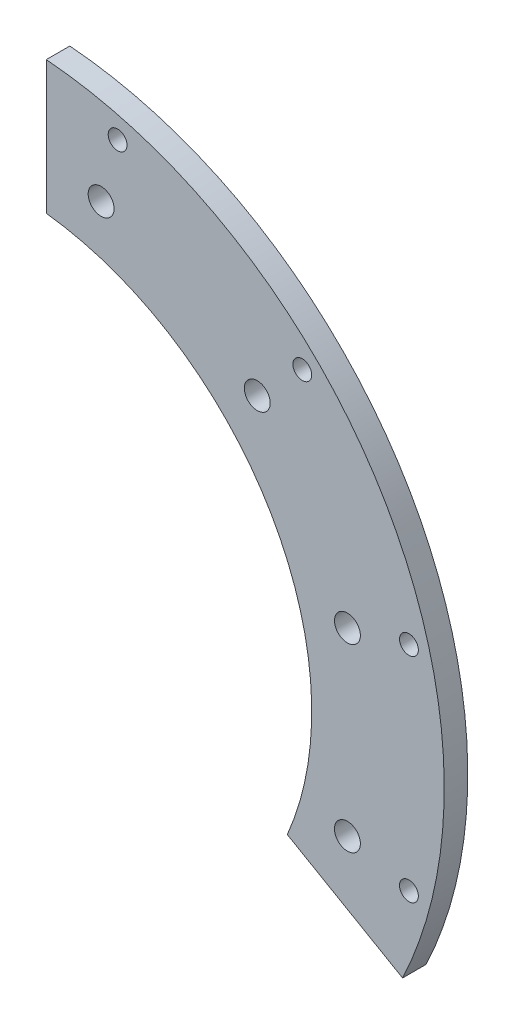
ISO-10303-21;
HEADER;
FILE_DESCRIPTION(('STEP AP214'),'2;1');
FILE_NAME('part.step','',(''),(''),'','','');
FILE_SCHEMA(('AUTOMOTIVE_DESIGN { 1 0 10303 214 1 1 1 1 }'));
ENDSEC;
DATA;
#1=APPLICATION_CONTEXT('core data for automotive mechanical design processes');
#2=APPLICATION_PROTOCOL_DEFINITION('international standard','automotive_design',2000,#1);
#3=PRODUCT_CONTEXT('',#1,'mechanical');
#4=PRODUCT('Part','Part','',(#3));
#5=PRODUCT_RELATED_PRODUCT_CATEGORY('part','',(#4));
#6=PRODUCT_DEFINITION_FORMATION('','',#4);
#7=PRODUCT_DEFINITION_CONTEXT('part definition',#1,'design');
#8=PRODUCT_DEFINITION('design','',#6,#7);
#9=PRODUCT_DEFINITION_SHAPE('','',#8);
#10=(LENGTH_UNIT() NAMED_UNIT(*) SI_UNIT(.MILLI.,.METRE.));
#11=(NAMED_UNIT(*) PLANE_ANGLE_UNIT() SI_UNIT($,.RADIAN.));
#12=(NAMED_UNIT(*) SI_UNIT($,.STERADIAN.) SOLID_ANGLE_UNIT());
#13=UNCERTAINTY_MEASURE_WITH_UNIT(LENGTH_MEASURE(1.E-05),#10,'distance_accuracy_value','');
#14=(GEOMETRIC_REPRESENTATION_CONTEXT(3) GLOBAL_UNCERTAINTY_ASSIGNED_CONTEXT((#13)) GLOBAL_UNIT_ASSIGNED_CONTEXT((#10,
#11,#12)) REPRESENTATION_CONTEXT('',''));
#15=CARTESIAN_POINT('',(0.,0.,0.));
#16=DIRECTION('',(0.,0.,1.));
#17=DIRECTION('',(1.,0.,0.));
#18=AXIS2_PLACEMENT_3D('',#15,#16,#17);
#19=CARTESIAN_POINT('',(0.,0.,4.));
#20=DIRECTION('',(0.,0.,-1.));
#21=DIRECTION('',(-1.,0.,0.));
#22=AXIS2_PLACEMENT_3D('',#19,#20,#21);
#23=CYLINDRICAL_SURFACE('',#22,73.61);
#24=CARTESIAN_POINT('',(0.,0.,0.));
#25=DIRECTION('',(0.,0.,-1.));
#26=DIRECTION('',(-1.,0.,0.));
#27=AXIS2_PLACEMENT_3D('',#24,#25,#26);
#28=CIRCLE('',#27,73.61);
#29=CARTESIAN_POINT('',(5.99999999999999,73.3650604852201,0.));
#30=VERTEX_POINT('',#29);
#31=CARTESIAN_POINT('',(66.5338665235516,-31.490898771331,0.));
#32=VERTEX_POINT('',#31);
#33=EDGE_CURVE('E99',#30,#32,#28,.T.);
#34=ORIENTED_EDGE('',*,*,#33,.F.);
#35=DIRECTION('',(0.,0.,-1.));
#36=VECTOR('',#35,1.);
#37=CARTESIAN_POINT('',(5.99999999999999,73.3650604852201,4.));
#38=LINE('',#37,#36);
#39=CARTESIAN_POINT('',(5.99999999999999,73.3650604852201,4.));
#40=VERTEX_POINT('',#39);
#41=EDGE_CURVE('E11',#40,#30,#38,.T.);
#42=ORIENTED_EDGE('',*,*,#41,.F.);
#43=CARTESIAN_POINT('',(0.,0.,4.));
#44=DIRECTION('',(0.,0.,-1.));
#45=DIRECTION('',(-1.,0.,0.));
#46=AXIS2_PLACEMENT_3D('',#43,#44,#45);
#47=CIRCLE('',#46,73.61);
#48=CARTESIAN_POINT('',(66.5338665235516,-31.490898771331,4.));
#49=VERTEX_POINT('',#48);
#50=EDGE_CURVE('E93',#40,#49,#47,.T.);
#51=ORIENTED_EDGE('',*,*,#50,.T.);
#52=DIRECTION('',(0.,0.,-1.));
#53=VECTOR('',#52,1.);
#54=CARTESIAN_POINT('',(66.5338665235516,-31.490898771331,4.));
#55=LINE('',#54,#53);
#56=EDGE_CURVE('E36',#49,#32,#55,.T.);
#57=ORIENTED_EDGE('',*,*,#56,.T.);
#58=EDGE_LOOP('',(#34,#42,#51,#57));
#59=FACE_BOUND('',#58,.T.);
#60=ADVANCED_FACE('F33',(#59),#23,.T.);
#61=CARTESIAN_POINT('',(5.99999999999999,73.3650604852201,4.));
#62=DIRECTION('',(1.,0.,0.));
#63=DIRECTION('',(0.,1.,0.));
#64=AXIS2_PLACEMENT_3D('',#61,#62,#63);
#65=PLANE('',#64);
#66=DIRECTION('',(0.,-1.,0.));
#67=VECTOR('',#66,1.);
#68=CARTESIAN_POINT('',(5.99999999999999,73.3650604852201,0.));
#69=LINE('',#68,#67);
#70=CARTESIAN_POINT('',(6.,50.7465269747596,0.));
#71=VERTEX_POINT('',#70);
#72=EDGE_CURVE('E66',#30,#71,#69,.T.);
#73=ORIENTED_EDGE('',*,*,#72,.T.);
#74=DIRECTION('',(0.,0.,-1.));
#75=VECTOR('',#74,1.);
#76=CARTESIAN_POINT('',(6.,50.7465269747596,4.));
#77=LINE('',#76,#75);
#78=CARTESIAN_POINT('',(6.,50.7465269747596,4.));
#79=VERTEX_POINT('',#78);
#80=EDGE_CURVE('E42',#79,#71,#77,.T.);
#81=ORIENTED_EDGE('',*,*,#80,.F.);
#82=DIRECTION('',(0.,-1.,0.));
#83=VECTOR('',#82,1.);
#84=CARTESIAN_POINT('',(5.99999999999999,73.3650604852201,4.));
#85=LINE('',#84,#83);
#86=EDGE_CURVE('E83',#40,#79,#85,.T.);
#87=ORIENTED_EDGE('',*,*,#86,.F.);
#88=ORIENTED_EDGE('',*,*,#41,.T.);
#89=EDGE_LOOP('',(#73,#81,#87,#88));
#90=FACE_BOUND('',#89,.T.);
#91=ADVANCED_FACE('F110',(#90),#65,.F.);
#92=CARTESIAN_POINT('',(0.,0.,4.));
#93=DIRECTION('',(0.,0.,-1.));
#94=DIRECTION('',(-1.,0.,0.));
#95=AXIS2_PLACEMENT_3D('',#92,#93,#94);
#96=CYLINDRICAL_SURFACE('',#95,51.1);
#97=CARTESIAN_POINT('',(0.,0.,0.));
#98=DIRECTION('',(0.,0.,-1.));
#99=DIRECTION('',(-1.,0.,0.));
#100=AXIS2_PLACEMENT_3D('',#97,#98,#99);
#101=CIRCLE('',#100,51.1);
#102=CARTESIAN_POINT('',(46.9457992095539,-20.18172283469,0.));
#103=VERTEX_POINT('',#102);
#104=EDGE_CURVE('E90',#71,#103,#101,.T.);
#105=ORIENTED_EDGE('',*,*,#104,.T.);
#106=DIRECTION('',(0.,0.,-1.));
#107=VECTOR('',#106,1.);
#108=CARTESIAN_POINT('',(46.9457992095539,-20.18172283469,4.));
#109=LINE('',#108,#107);
#110=CARTESIAN_POINT('',(46.9457992095539,-20.18172283469,4.));
#111=VERTEX_POINT('',#110);
#112=EDGE_CURVE('E87',#111,#103,#109,.T.);
#113=ORIENTED_EDGE('',*,*,#112,.F.);
#114=CARTESIAN_POINT('',(0.,0.,4.));
#115=DIRECTION('',(0.,0.,-1.));
#116=DIRECTION('',(-1.,0.,0.));
#117=AXIS2_PLACEMENT_3D('',#114,#115,#116);
#118=CIRCLE('',#117,51.1);
#119=EDGE_CURVE('E78',#79,#111,#118,.T.);
#120=ORIENTED_EDGE('',*,*,#119,.F.);
#121=ORIENTED_EDGE('',*,*,#80,.T.);
#122=EDGE_LOOP('',(#105,#113,#120,#121));
#123=FACE_BOUND('',#122,.T.);
#124=ADVANCED_FACE('F88',(#123),#96,.F.);
#125=CARTESIAN_POINT('',(66.5338665235516,-31.490898771331,4.));
#126=DIRECTION('',(-0.499999999999998,-0.86602540378444,0.));
#127=DIRECTION('',(0.86602540378444,-0.499999999999998,0.));
#128=AXIS2_PLACEMENT_3D('',#125,#126,#127);
#129=PLANE('',#128);
#130=DIRECTION('',(-0.86602540378444,0.499999999999998,0.));
#131=VECTOR('',#130,1.);
#132=CARTESIAN_POINT('',(66.5338665235516,-31.490898771331,0.));
#133=LINE('',#132,#131);
#134=EDGE_CURVE('E102',#32,#103,#133,.T.);
#135=ORIENTED_EDGE('',*,*,#134,.F.);
#136=ORIENTED_EDGE('',*,*,#56,.F.);
#137=DIRECTION('',(-0.86602540378444,0.499999999999998,0.));
#138=VECTOR('',#137,1.);
#139=CARTESIAN_POINT('',(66.5338665235516,-31.490898771331,4.));
#140=LINE('',#139,#138);
#141=EDGE_CURVE('E82',#49,#111,#140,.T.);
#142=ORIENTED_EDGE('',*,*,#141,.T.);
#143=ORIENTED_EDGE('',*,*,#112,.T.);
#144=EDGE_LOOP('',(#135,#136,#142,#143));
#145=FACE_BOUND('',#144,.T.);
#146=ADVANCED_FACE('F92',(#145),#129,.T.);
#147=CARTESIAN_POINT('',(0.,0.,4.));
#148=DIRECTION('',(0.,0.,-1.));
#149=DIRECTION('',(-1.,0.,0.));
#150=AXIS2_PLACEMENT_3D('',#147,#148,#149);
#151=PLANE('',#150);
#152=CARTESIAN_POINT('',(41.84657931062,41.8465793106198,4.));
#153=DIRECTION('',(0.,0.,1.));
#154=DIRECTION('',(0.866025403784438,-0.500000000000001,0.));
#155=AXIS2_PLACEMENT_3D('',#152,#153,#154);
#156=CIRCLE('',#155,2.2);
#157=CARTESIAN_POINT('',(43.7518351989457,40.7465793106198,4.));
#158=VERTEX_POINT('',#157);
#159=EDGE_CURVE('E194',#158,#158,#156,.T.);
#160=ORIENTED_EDGE('',*,*,#159,.F.);
#161=EDGE_LOOP('',(#160));
#162=FACE_BOUND('',#161,.T.);
#163=CARTESIAN_POINT('',(67.6148078402348,18.1173331571763,4.));
#164=DIRECTION('',(0.,0.,1.));
#165=DIRECTION('',(0.499999999999998,-0.86602540378444,0.));
#166=AXIS2_PLACEMENT_3D('',#163,#164,#165);
#167=CIRCLE('',#166,1.60000000000001);
#168=CARTESIAN_POINT('',(68.4148078402348,16.7316925111211,4.));
#169=VERTEX_POINT('',#168);
#170=EDGE_CURVE('E176',#169,#169,#167,.T.);
#171=ORIENTED_EDGE('',*,*,#170,.F.);
#172=EDGE_LOOP('',(#171));
#173=FACE_BOUND('',#172,.T.);
#174=CARTESIAN_POINT('',(57.1634903997871,15.316911089167,4.));
#175=DIRECTION('',(0.,0.,1.));
#176=DIRECTION('',(0.499999999999998,-0.86602540378444,0.));
#177=AXIS2_PLACEMENT_3D('',#174,#175,#176);
#178=CIRCLE('',#177,2.2);
#179=CARTESIAN_POINT('',(58.2634903997871,13.4116552008412,4.));
#180=VERTEX_POINT('',#179);
#181=EDGE_CURVE('E172',#180,#180,#178,.T.);
#182=ORIENTED_EDGE('',*,*,#181,.F.);
#183=EDGE_LOOP('',(#182));
#184=FACE_BOUND('',#183,.T.);
#185=CARTESIAN_POINT('',(67.6148078402347,-18.1173331571767,4.));
#186=DIRECTION('',(0.,0.,1.));
#187=DIRECTION('',(0.,-1.,0.));
#188=AXIS2_PLACEMENT_3D('',#185,#186,#187);
#189=CIRCLE('',#188,1.60000000000001);
#190=CARTESIAN_POINT('',(67.6148078402347,-19.7173331571767,4.));
#191=VERTEX_POINT('',#190);
#192=EDGE_CURVE('E179',#191,#191,#189,.T.);
#193=ORIENTED_EDGE('',*,*,#192,.F.);
#194=EDGE_LOOP('',(#193));
#195=FACE_BOUND('',#194,.T.);
#196=CARTESIAN_POINT('',(57.163490399787,-15.3169110891674,4.));
#197=DIRECTION('',(0.,0.,1.));
#198=DIRECTION('',(0.,-1.,0.));
#199=AXIS2_PLACEMENT_3D('',#196,#197,#198);
#200=CIRCLE('',#199,2.2);
#201=CARTESIAN_POINT('',(57.163490399787,-17.5169110891674,4.));
#202=VERTEX_POINT('',#201);
#203=EDGE_CURVE('E187',#202,#202,#200,.T.);
#204=ORIENTED_EDGE('',*,*,#203,.F.);
#205=EDGE_LOOP('',(#204));
#206=FACE_BOUND('',#205,.T.);
#207=CARTESIAN_POINT('',(49.4974746830584,49.4974746830583,4.));
#208=DIRECTION('',(0.,0.,1.));
#209=DIRECTION('',(0.866025403784438,-0.500000000000001,0.));
#210=AXIS2_PLACEMENT_3D('',#207,#208,#209);
#211=CIRCLE('',#210,1.60000000000001);
#212=CARTESIAN_POINT('',(50.8831153291135,48.6974746830582,4.));
#213=VERTEX_POINT('',#212);
#214=EDGE_CURVE('E193',#213,#213,#211,.T.);
#215=ORIENTED_EDGE('',*,*,#214,.F.);
#216=EDGE_LOOP('',(#215));
#217=FACE_BOUND('',#216,.T.);
#218=CARTESIAN_POINT('',(15.3169110891672,57.1634903997871,4.));
#219=DIRECTION('',(0.,0.,1.));
#220=DIRECTION('',(1.,0.,0.));
#221=AXIS2_PLACEMENT_3D('',#218,#219,#220);
#222=CIRCLE('',#221,2.2);
#223=CARTESIAN_POINT('',(17.5169110891672,57.1634903997871,4.));
#224=VERTEX_POINT('',#223);
#225=EDGE_CURVE('E205',#224,#224,#222,.T.);
#226=ORIENTED_EDGE('',*,*,#225,.F.);
#227=EDGE_LOOP('',(#226));
#228=FACE_BOUND('',#227,.T.);
#229=CARTESIAN_POINT('',(18.1173331571765,67.6148078402348,4.));
#230=DIRECTION('',(0.,0.,1.));
#231=DIRECTION('',(1.,0.,0.));
#232=AXIS2_PLACEMENT_3D('',#229,#230,#231);
#233=CIRCLE('',#232,1.60000000000001);
#234=CARTESIAN_POINT('',(19.7173331571765,67.6148078402348,4.));
#235=VERTEX_POINT('',#234);
#236=EDGE_CURVE('E211',#235,#235,#233,.T.);
#237=ORIENTED_EDGE('',*,*,#236,.F.);
#238=EDGE_LOOP('',(#237));
#239=FACE_BOUND('',#238,.T.);
#240=ORIENTED_EDGE('',*,*,#50,.F.);
#241=ORIENTED_EDGE('',*,*,#86,.T.);
#242=ORIENTED_EDGE('',*,*,#119,.T.);
#243=ORIENTED_EDGE('',*,*,#141,.F.);
#244=EDGE_LOOP('',(#240,#241,#242,#243));
#245=FACE_BOUND('',#244,.T.);
#246=ADVANCED_FACE('F81',(#162,#173,#184,#195,#206,#217,#228,#239,#245),#151,.F.);
#247=CARTESIAN_POINT('',(0.,0.,0.));
#248=DIRECTION('',(0.,0.,-1.));
#249=DIRECTION('',(-1.,0.,0.));
#250=AXIS2_PLACEMENT_3D('',#247,#248,#249);
#251=PLANE('',#250);
#252=CARTESIAN_POINT('',(41.84657931062,41.8465793106198,0.));
#253=DIRECTION('',(0.,0.,1.));
#254=DIRECTION('',(0.866025403784438,-0.500000000000001,0.));
#255=AXIS2_PLACEMENT_3D('',#252,#253,#254);
#256=CIRCLE('',#255,2.2);
#257=CARTESIAN_POINT('',(43.7518351989457,40.7465793106198,0.));
#258=VERTEX_POINT('',#257);
#259=EDGE_CURVE('E190',#258,#258,#256,.T.);
#260=ORIENTED_EDGE('',*,*,#259,.T.);
#261=EDGE_LOOP('',(#260));
#262=FACE_BOUND('',#261,.T.);
#263=CARTESIAN_POINT('',(67.6148078402348,18.1173331571763,0.));
#264=DIRECTION('',(0.,0.,1.));
#265=DIRECTION('',(0.499999999999998,-0.86602540378444,0.));
#266=AXIS2_PLACEMENT_3D('',#263,#264,#265);
#267=CIRCLE('',#266,1.60000000000001);
#268=CARTESIAN_POINT('',(68.4148078402348,16.7316925111211,0.));
#269=VERTEX_POINT('',#268);
#270=EDGE_CURVE('E197',#269,#269,#267,.T.);
#271=ORIENTED_EDGE('',*,*,#270,.T.);
#272=EDGE_LOOP('',(#271));
#273=FACE_BOUND('',#272,.T.);
#274=CARTESIAN_POINT('',(57.1634903997871,15.316911089167,0.));
#275=DIRECTION('',(0.,0.,1.));
#276=DIRECTION('',(0.499999999999998,-0.86602540378444,0.));
#277=AXIS2_PLACEMENT_3D('',#274,#275,#276);
#278=CIRCLE('',#277,2.2);
#279=CARTESIAN_POINT('',(58.2634903997871,13.4116552008412,0.));
#280=VERTEX_POINT('',#279);
#281=EDGE_CURVE('E169',#280,#280,#278,.T.);
#282=ORIENTED_EDGE('',*,*,#281,.T.);
#283=EDGE_LOOP('',(#282));
#284=FACE_BOUND('',#283,.T.);
#285=CARTESIAN_POINT('',(67.6148078402347,-18.1173331571767,0.));
#286=DIRECTION('',(0.,0.,1.));
#287=DIRECTION('',(0.,-1.,0.));
#288=AXIS2_PLACEMENT_3D('',#285,#286,#287);
#289=CIRCLE('',#288,1.60000000000001);
#290=CARTESIAN_POINT('',(67.6148078402347,-19.7173331571767,0.));
#291=VERTEX_POINT('',#290);
#292=EDGE_CURVE('E174',#291,#291,#289,.T.);
#293=ORIENTED_EDGE('',*,*,#292,.T.);
#294=EDGE_LOOP('',(#293));
#295=FACE_BOUND('',#294,.T.);
#296=CARTESIAN_POINT('',(57.163490399787,-15.3169110891674,0.));
#297=DIRECTION('',(0.,0.,1.));
#298=DIRECTION('',(0.,-1.,0.));
#299=AXIS2_PLACEMENT_3D('',#296,#297,#298);
#300=CIRCLE('',#299,2.2);
#301=CARTESIAN_POINT('',(57.163490399787,-17.5169110891674,0.));
#302=VERTEX_POINT('',#301);
#303=EDGE_CURVE('E184',#302,#302,#300,.T.);
#304=ORIENTED_EDGE('',*,*,#303,.T.);
#305=EDGE_LOOP('',(#304));
#306=FACE_BOUND('',#305,.T.);
#307=CARTESIAN_POINT('',(49.4974746830584,49.4974746830583,0.));
#308=DIRECTION('',(0.,0.,1.));
#309=DIRECTION('',(0.866025403784438,-0.500000000000001,0.));
#310=AXIS2_PLACEMENT_3D('',#307,#308,#309);
#311=CIRCLE('',#310,1.60000000000001);
#312=CARTESIAN_POINT('',(50.8831153291135,48.6974746830582,0.));
#313=VERTEX_POINT('',#312);
#314=EDGE_CURVE('E202',#313,#313,#311,.T.);
#315=ORIENTED_EDGE('',*,*,#314,.T.);
#316=EDGE_LOOP('',(#315));
#317=FACE_BOUND('',#316,.T.);
#318=CARTESIAN_POINT('',(15.3169110891672,57.1634903997871,0.));
#319=DIRECTION('',(0.,0.,1.));
#320=DIRECTION('',(1.,0.,0.));
#321=AXIS2_PLACEMENT_3D('',#318,#319,#320);
#322=CIRCLE('',#321,2.2);
#323=CARTESIAN_POINT('',(17.5169110891672,57.1634903997871,0.));
#324=VERTEX_POINT('',#323);
#325=EDGE_CURVE('E208',#324,#324,#322,.T.);
#326=ORIENTED_EDGE('',*,*,#325,.T.);
#327=EDGE_LOOP('',(#326));
#328=FACE_BOUND('',#327,.T.);
#329=CARTESIAN_POINT('',(18.1173331571765,67.6148078402348,0.));
#330=DIRECTION('',(0.,0.,1.));
#331=DIRECTION('',(1.,0.,0.));
#332=AXIS2_PLACEMENT_3D('',#329,#330,#331);
#333=CIRCLE('',#332,1.60000000000001);
#334=CARTESIAN_POINT('',(19.7173331571765,67.6148078402348,0.));
#335=VERTEX_POINT('',#334);
#336=EDGE_CURVE('E103',#335,#335,#333,.T.);
#337=ORIENTED_EDGE('',*,*,#336,.T.);
#338=EDGE_LOOP('',(#337));
#339=FACE_BOUND('',#338,.T.);
#340=ORIENTED_EDGE('',*,*,#33,.T.);
#341=ORIENTED_EDGE('',*,*,#134,.T.);
#342=ORIENTED_EDGE('',*,*,#104,.F.);
#343=ORIENTED_EDGE('',*,*,#72,.F.);
#344=EDGE_LOOP('',(#340,#341,#342,#343));
#345=FACE_BOUND('',#344,.T.);
#346=ADVANCED_FACE('F108',(#262,#273,#284,#295,#306,#317,#328,#339,#345),#251,.T.);
#347=CARTESIAN_POINT('',(18.1173331571765,67.6148078402348,0.));
#348=DIRECTION('',(0.,0.,1.));
#349=DIRECTION('',(1.,0.,0.));
#350=AXIS2_PLACEMENT_3D('',#347,#348,#349);
#351=CYLINDRICAL_SURFACE('',#350,1.60000000000001);
#352=ORIENTED_EDGE('',*,*,#336,.F.);
#353=EDGE_LOOP('',(#352));
#354=FACE_BOUND('',#353,.T.);
#355=ORIENTED_EDGE('',*,*,#236,.T.);
#356=EDGE_LOOP('',(#355));
#357=FACE_BOUND('',#356,.T.);
#358=ADVANCED_FACE('F129',(#354,#357),#351,.F.);
#359=CARTESIAN_POINT('',(15.3169110891672,57.1634903997871,0.));
#360=DIRECTION('',(0.,0.,1.));
#361=DIRECTION('',(1.,0.,0.));
#362=AXIS2_PLACEMENT_3D('',#359,#360,#361);
#363=CYLINDRICAL_SURFACE('',#362,2.2);
#364=ORIENTED_EDGE('',*,*,#325,.F.);
#365=EDGE_LOOP('',(#364));
#366=FACE_BOUND('',#365,.T.);
#367=ORIENTED_EDGE('',*,*,#225,.T.);
#368=EDGE_LOOP('',(#367));
#369=FACE_BOUND('',#368,.T.);
#370=ADVANCED_FACE('F136',(#366,#369),#363,.F.);
#371=CARTESIAN_POINT('',(49.4974746830584,49.4974746830583,0.));
#372=DIRECTION('',(0.,0.,1.));
#373=DIRECTION('',(1.,0.,0.));
#374=AXIS2_PLACEMENT_3D('',#371,#372,#373);
#375=CYLINDRICAL_SURFACE('',#374,1.60000000000001);
#376=ORIENTED_EDGE('',*,*,#314,.F.);
#377=EDGE_LOOP('',(#376));
#378=FACE_BOUND('',#377,.T.);
#379=ORIENTED_EDGE('',*,*,#214,.T.);
#380=EDGE_LOOP('',(#379));
#381=FACE_BOUND('',#380,.T.);
#382=ADVANCED_FACE('F140',(#378,#381),#375,.F.);
#383=CARTESIAN_POINT('',(57.163490399787,-15.3169110891674,0.));
#384=DIRECTION('',(0.,0.,1.));
#385=DIRECTION('',(1.,0.,0.));
#386=AXIS2_PLACEMENT_3D('',#383,#384,#385);
#387=CYLINDRICAL_SURFACE('',#386,2.2);
#388=ORIENTED_EDGE('',*,*,#303,.F.);
#389=EDGE_LOOP('',(#388));
#390=FACE_BOUND('',#389,.T.);
#391=ORIENTED_EDGE('',*,*,#203,.T.);
#392=EDGE_LOOP('',(#391));
#393=FACE_BOUND('',#392,.T.);
#394=ADVANCED_FACE('F144',(#390,#393),#387,.F.);
#395=CARTESIAN_POINT('',(67.6148078402347,-18.1173331571767,0.));
#396=DIRECTION('',(0.,0.,1.));
#397=DIRECTION('',(1.,0.,0.));
#398=AXIS2_PLACEMENT_3D('',#395,#396,#397);
#399=CYLINDRICAL_SURFACE('',#398,1.60000000000001);
#400=ORIENTED_EDGE('',*,*,#292,.F.);
#401=EDGE_LOOP('',(#400));
#402=FACE_BOUND('',#401,.T.);
#403=ORIENTED_EDGE('',*,*,#192,.T.);
#404=EDGE_LOOP('',(#403));
#405=FACE_BOUND('',#404,.T.);
#406=ADVANCED_FACE('F157',(#402,#405),#399,.F.);
#407=CARTESIAN_POINT('',(57.1634903997871,15.316911089167,0.));
#408=DIRECTION('',(0.,0.,1.));
#409=DIRECTION('',(1.,0.,0.));
#410=AXIS2_PLACEMENT_3D('',#407,#408,#409);
#411=CYLINDRICAL_SURFACE('',#410,2.2);
#412=ORIENTED_EDGE('',*,*,#281,.F.);
#413=EDGE_LOOP('',(#412));
#414=FACE_BOUND('',#413,.T.);
#415=ORIENTED_EDGE('',*,*,#181,.T.);
#416=EDGE_LOOP('',(#415));
#417=FACE_BOUND('',#416,.T.);
#418=ADVANCED_FACE('F150',(#414,#417),#411,.F.);
#419=CARTESIAN_POINT('',(67.6148078402348,18.1173331571763,0.));
#420=DIRECTION('',(0.,0.,1.));
#421=DIRECTION('',(1.,0.,0.));
#422=AXIS2_PLACEMENT_3D('',#419,#420,#421);
#423=CYLINDRICAL_SURFACE('',#422,1.60000000000001);
#424=ORIENTED_EDGE('',*,*,#270,.F.);
#425=EDGE_LOOP('',(#424));
#426=FACE_BOUND('',#425,.T.);
#427=ORIENTED_EDGE('',*,*,#170,.T.);
#428=EDGE_LOOP('',(#427));
#429=FACE_BOUND('',#428,.T.);
#430=ADVANCED_FACE('F146',(#426,#429),#423,.F.);
#431=CARTESIAN_POINT('',(41.84657931062,41.8465793106198,0.));
#432=DIRECTION('',(0.,0.,1.));
#433=DIRECTION('',(1.,0.,0.));
#434=AXIS2_PLACEMENT_3D('',#431,#432,#433);
#435=CYLINDRICAL_SURFACE('',#434,2.2);
#436=ORIENTED_EDGE('',*,*,#259,.F.);
#437=EDGE_LOOP('',(#436));
#438=FACE_BOUND('',#437,.T.);
#439=ORIENTED_EDGE('',*,*,#159,.T.);
#440=EDGE_LOOP('',(#439));
#441=FACE_BOUND('',#440,.T.);
#442=ADVANCED_FACE('F149',(#438,#441),#435,.F.);
#443=CLOSED_SHELL('',(#60,#91,#124,#146,#246,#346,#358,#370,#382,#394,#406,#418,#430,#442));
#444=MANIFOLD_SOLID_BREP('B2',#443);
#445=ADVANCED_BREP_SHAPE_REPRESENTATION('',(#18,#444),#14);
#446=SHAPE_DEFINITION_REPRESENTATION(#9,#445);
ENDSEC;
END-ISO-10303-21;
